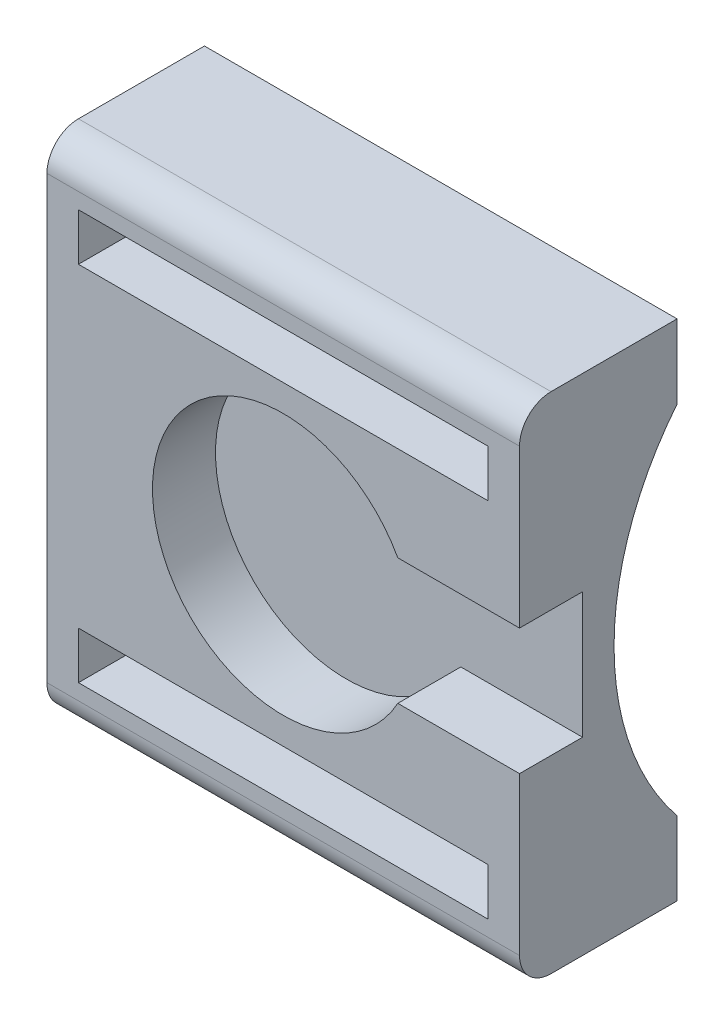
ISO-10303-21;
HEADER;
FILE_DESCRIPTION(('STEP AP214'),'2;1');
FILE_NAME('part.step','',(''),(''),'','','');
FILE_SCHEMA(('AUTOMOTIVE_DESIGN { 1 0 10303 214 1 1 1 1 }'));
ENDSEC;
DATA;
#1=APPLICATION_CONTEXT('core data for automotive mechanical design processes');
#2=APPLICATION_PROTOCOL_DEFINITION('international standard','automotive_design',2000,#1);
#3=PRODUCT_CONTEXT('',#1,'mechanical');
#4=PRODUCT('Part','Part','',(#3));
#5=PRODUCT_RELATED_PRODUCT_CATEGORY('part','',(#4));
#6=PRODUCT_DEFINITION_FORMATION('','',#4);
#7=PRODUCT_DEFINITION_CONTEXT('part definition',#1,'design');
#8=PRODUCT_DEFINITION('design','',#6,#7);
#9=PRODUCT_DEFINITION_SHAPE('','',#8);
#10=(LENGTH_UNIT() NAMED_UNIT(*) SI_UNIT(.MILLI.,.METRE.));
#11=(NAMED_UNIT(*) PLANE_ANGLE_UNIT() SI_UNIT($,.RADIAN.));
#12=(NAMED_UNIT(*) SI_UNIT($,.STERADIAN.) SOLID_ANGLE_UNIT());
#13=UNCERTAINTY_MEASURE_WITH_UNIT(LENGTH_MEASURE(1.E-05),#10,'distance_accuracy_value','');
#14=(GEOMETRIC_REPRESENTATION_CONTEXT(3) GLOBAL_UNCERTAINTY_ASSIGNED_CONTEXT((#13)) GLOBAL_UNIT_ASSIGNED_CONTEXT((#10,
#11,#12)) REPRESENTATION_CONTEXT('',''));
#15=CARTESIAN_POINT('',(0.,0.,0.));
#16=DIRECTION('',(0.,0.,1.));
#17=DIRECTION('',(1.,0.,0.));
#18=AXIS2_PLACEMENT_3D('',#15,#16,#17);
#19=CARTESIAN_POINT('',(0.,0.,0.));
#20=DIRECTION('',(0.,0.,1.));
#21=DIRECTION('',(1.,0.,0.));
#22=AXIS2_PLACEMENT_3D('',#19,#20,#21);
#23=PLANE('',#22);
#24=DIRECTION('',(0.,1.,0.));
#25=VECTOR('',#24,1.);
#26=CARTESIAN_POINT('',(7.5,8.,0.));
#27=LINE('',#26,#25);
#28=CARTESIAN_POINT('',(7.5,5.65685424949238,0.));
#29=VERTEX_POINT('',#28);
#30=CARTESIAN_POINT('',(7.5,8.,0.));
#31=VERTEX_POINT('',#30);
#32=EDGE_CURVE('E309',#29,#31,#27,.T.);
#33=ORIENTED_EDGE('',*,*,#32,.F.);
#34=DIRECTION('',(-1.,0.,0.));
#35=VECTOR('',#34,1.);
#36=CARTESIAN_POINT('',(42.5,5.65685424949238,0.));
#37=LINE('',#36,#35);
#38=CARTESIAN_POINT('',(6.5,5.65685424949238,0.));
#39=VERTEX_POINT('',#38);
#40=EDGE_CURVE('E427',#29,#39,#37,.T.);
#41=ORIENTED_EDGE('',*,*,#40,.T.);
#42=DIRECTION('',(0.,1.,0.));
#43=VECTOR('',#42,1.);
#44=CARTESIAN_POINT('',(6.5,0.,0.));
#45=LINE('',#44,#43);
#46=CARTESIAN_POINT('',(6.5,6.5,0.));
#47=VERTEX_POINT('',#46);
#48=EDGE_CURVE('E258',#39,#47,#45,.T.);
#49=ORIENTED_EDGE('',*,*,#48,.T.);
#50=DIRECTION('',(-1.,0.,0.));
#51=VECTOR('',#50,1.);
#52=CARTESIAN_POINT('',(0.,6.5,0.));
#53=LINE('',#52,#51);
#54=CARTESIAN_POINT('',(-6.5,6.5,0.));
#55=VERTEX_POINT('',#54);
#56=EDGE_CURVE('E261',#47,#55,#53,.T.);
#57=ORIENTED_EDGE('',*,*,#56,.T.);
#58=DIRECTION('',(0.,-1.,0.));
#59=VECTOR('',#58,1.);
#60=CARTESIAN_POINT('',(-6.5,0.,0.));
#61=LINE('',#60,#59);
#62=CARTESIAN_POINT('',(-6.5,5.65685424949238,0.));
#63=VERTEX_POINT('',#62);
#64=EDGE_CURVE('E265',#55,#63,#61,.T.);
#65=ORIENTED_EDGE('',*,*,#64,.T.);
#66=CARTESIAN_POINT('',(-7.5,5.65685424949238,0.));
#67=VERTEX_POINT('',#66);
#68=EDGE_CURVE('E428',#63,#67,#37,.T.);
#69=ORIENTED_EDGE('',*,*,#68,.T.);
#70=DIRECTION('',(0.,-1.,0.));
#71=VECTOR('',#70,1.);
#72=CARTESIAN_POINT('',(-7.5,8.,0.));
#73=LINE('',#72,#71);
#74=CARTESIAN_POINT('',(-7.5,8.,0.));
#75=VERTEX_POINT('',#74);
#76=EDGE_CURVE('E213',#75,#67,#73,.T.);
#77=ORIENTED_EDGE('',*,*,#76,.F.);
#78=DIRECTION('',(-1.,0.,0.));
#79=VECTOR('',#78,1.);
#80=CARTESIAN_POINT('',(-7.5,8.,0.));
#81=LINE('',#80,#79);
#82=EDGE_CURVE('E222',#31,#75,#81,.T.);
#83=ORIENTED_EDGE('',*,*,#82,.F.);
#84=EDGE_LOOP('',(#33,#41,#49,#57,#65,#69,#77,#83));
#85=FACE_BOUND('',#84,.T.);
#86=ADVANCED_FACE('F45',(#85),#23,.F.);
#87=CARTESIAN_POINT('',(7.5,8.,5.));
#88=DIRECTION('',(-1.,0.,0.));
#89=DIRECTION('',(0.,-1.,0.));
#90=AXIS2_PLACEMENT_3D('',#87,#88,#89);
#91=PLANE('',#90);
#92=DIRECTION('',(0.,1.,0.));
#93=VECTOR('',#92,1.);
#94=CARTESIAN_POINT('',(7.5,8.,5.));
#95=LINE('',#94,#93);
#96=CARTESIAN_POINT('',(7.5,-7.,5.));
#97=VERTEX_POINT('',#96);
#98=CARTESIAN_POINT('',(7.5,-2.,5.));
#99=VERTEX_POINT('',#98);
#100=EDGE_CURVE('E295',#97,#99,#95,.T.);
#101=ORIENTED_EDGE('',*,*,#100,.F.);
#102=CARTESIAN_POINT('',(7.5,-7.,4.));
#103=DIRECTION('',(-1.,0.,0.));
#104=DIRECTION('',(0.,-1.,0.));
#105=AXIS2_PLACEMENT_3D('',#102,#103,#104);
#106=CIRCLE('',#105,1.);
#107=CARTESIAN_POINT('',(7.5,-8.,4.));
#108=VERTEX_POINT('',#107);
#109=EDGE_CURVE('E68',#97,#108,#106,.F.);
#110=ORIENTED_EDGE('',*,*,#109,.T.);
#111=DIRECTION('',(0.,0.,-1.));
#112=VECTOR('',#111,1.);
#113=CARTESIAN_POINT('',(7.5,-8.,5.));
#114=LINE('',#113,#112);
#115=CARTESIAN_POINT('',(7.5,-8.,0.));
#116=VERTEX_POINT('',#115);
#117=EDGE_CURVE('E234',#108,#116,#114,.T.);
#118=ORIENTED_EDGE('',*,*,#117,.T.);
#119=CARTESIAN_POINT('',(7.5,-5.65685424949238,0.));
#120=VERTEX_POINT('',#119);
#121=EDGE_CURVE('E227',#116,#120,#27,.T.);
#122=ORIENTED_EDGE('',*,*,#121,.T.);
#123=CARTESIAN_POINT('',(7.5,0.,-7.));
#124=DIRECTION('',(-1.,0.,0.));
#125=DIRECTION('',(0.,-1.,0.));
#126=AXIS2_PLACEMENT_3D('',#123,#124,#125);
#127=CIRCLE('',#126,9.);
#128=EDGE_CURVE('E424',#120,#29,#127,.T.);
#129=ORIENTED_EDGE('',*,*,#128,.T.);
#130=ORIENTED_EDGE('',*,*,#32,.T.);
#131=DIRECTION('',(0.,0.,-1.));
#132=VECTOR('',#131,1.);
#133=CARTESIAN_POINT('',(7.5,8.,5.));
#134=LINE('',#133,#132);
#135=CARTESIAN_POINT('',(7.5,8.,4.));
#136=VERTEX_POINT('',#135);
#137=EDGE_CURVE('E244',#136,#31,#134,.T.);
#138=ORIENTED_EDGE('',*,*,#137,.F.);
#139=CARTESIAN_POINT('',(7.5,7.,4.));
#140=DIRECTION('',(-1.,0.,0.));
#141=DIRECTION('',(0.,-1.,0.));
#142=AXIS2_PLACEMENT_3D('',#139,#140,#141);
#143=CIRCLE('',#142,1.);
#144=CARTESIAN_POINT('',(7.5,7.,5.));
#145=VERTEX_POINT('',#144);
#146=EDGE_CURVE('E283',#136,#145,#143,.F.);
#147=ORIENTED_EDGE('',*,*,#146,.T.);
#148=CARTESIAN_POINT('',(7.5,2.,5.));
#149=VERTEX_POINT('',#148);
#150=EDGE_CURVE('E233',#149,#145,#95,.T.);
#151=ORIENTED_EDGE('',*,*,#150,.F.);
#152=DIRECTION('',(0.,0.,1.));
#153=VECTOR('',#152,1.);
#154=CARTESIAN_POINT('',(7.5,2.,7.));
#155=LINE('',#154,#153);
#156=CARTESIAN_POINT('',(7.5,2.,3.));
#157=VERTEX_POINT('',#156);
#158=EDGE_CURVE('E350',#157,#149,#155,.T.);
#159=ORIENTED_EDGE('',*,*,#158,.F.);
#160=DIRECTION('',(0.,1.,0.));
#161=VECTOR('',#160,1.);
#162=CARTESIAN_POINT('',(7.5,2.,3.));
#163=LINE('',#162,#161);
#164=CARTESIAN_POINT('',(7.5,-2.,3.));
#165=VERTEX_POINT('',#164);
#166=EDGE_CURVE('E353',#165,#157,#163,.T.);
#167=ORIENTED_EDGE('',*,*,#166,.F.);
#168=DIRECTION('',(0.,0.,-1.));
#169=VECTOR('',#168,1.);
#170=CARTESIAN_POINT('',(7.5,-2.,7.));
#171=LINE('',#170,#169);
#172=EDGE_CURVE('E344',#99,#165,#171,.T.);
#173=ORIENTED_EDGE('',*,*,#172,.F.);
#174=EDGE_LOOP('',(#101,#110,#118,#122,#129,#130,#138,#147,#151,#159,#167,#173));
#175=FACE_BOUND('',#174,.T.);
#176=ADVANCED_FACE('F459',(#175),#91,.F.);
#177=CARTESIAN_POINT('',(-7.5,8.,5.));
#178=DIRECTION('',(0.,-1.,0.));
#179=DIRECTION('',(0.,0.,-1.));
#180=AXIS2_PLACEMENT_3D('',#177,#178,#179);
#181=PLANE('',#180);
#182=DIRECTION('',(0.,0.,-1.));
#183=VECTOR('',#182,1.);
#184=CARTESIAN_POINT('',(-7.5,8.,5.));
#185=LINE('',#184,#183);
#186=CARTESIAN_POINT('',(-7.5,8.,4.));
#187=VERTEX_POINT('',#186);
#188=EDGE_CURVE('E241',#187,#75,#185,.T.);
#189=ORIENTED_EDGE('',*,*,#188,.F.);
#190=DIRECTION('',(-1.,0.,0.));
#191=VECTOR('',#190,1.);
#192=CARTESIAN_POINT('',(7.5,8.,4.));
#193=LINE('',#192,#191);
#194=EDGE_CURVE('E280',#187,#136,#193,.F.);
#195=ORIENTED_EDGE('',*,*,#194,.T.);
#196=ORIENTED_EDGE('',*,*,#137,.T.);
#197=ORIENTED_EDGE('',*,*,#82,.T.);
#198=EDGE_LOOP('',(#189,#195,#196,#197));
#199=FACE_BOUND('',#198,.T.);
#200=ADVANCED_FACE('F462',(#199),#181,.F.);
#201=CARTESIAN_POINT('',(-7.5,8.,5.));
#202=DIRECTION('',(1.,0.,0.));
#203=DIRECTION('',(0.,1.,0.));
#204=AXIS2_PLACEMENT_3D('',#201,#202,#203);
#205=PLANE('',#204);
#206=DIRECTION('',(0.,0.,-1.));
#207=VECTOR('',#206,1.);
#208=CARTESIAN_POINT('',(-7.5,-8.,5.));
#209=LINE('',#208,#207);
#210=CARTESIAN_POINT('',(-7.5,-8.,4.));
#211=VERTEX_POINT('',#210);
#212=CARTESIAN_POINT('',(-7.5,-8.,0.));
#213=VERTEX_POINT('',#212);
#214=EDGE_CURVE('E237',#211,#213,#209,.T.);
#215=ORIENTED_EDGE('',*,*,#214,.F.);
#216=CARTESIAN_POINT('',(-7.5,-7.,4.));
#217=DIRECTION('',(1.,0.,0.));
#218=DIRECTION('',(0.,1.,0.));
#219=AXIS2_PLACEMENT_3D('',#216,#217,#218);
#220=CIRCLE('',#219,1.);
#221=CARTESIAN_POINT('',(-7.5,-7.,5.));
#222=VERTEX_POINT('',#221);
#223=EDGE_CURVE('E11',#211,#222,#220,.F.);
#224=ORIENTED_EDGE('',*,*,#223,.T.);
#225=DIRECTION('',(0.,-1.,0.));
#226=VECTOR('',#225,1.);
#227=CARTESIAN_POINT('',(-7.5,8.,5.));
#228=LINE('',#227,#226);
#229=CARTESIAN_POINT('',(-7.5,7.,5.));
#230=VERTEX_POINT('',#229);
#231=EDGE_CURVE('E238',#230,#222,#228,.T.);
#232=ORIENTED_EDGE('',*,*,#231,.F.);
#233=CARTESIAN_POINT('',(-7.5,7.,4.));
#234=DIRECTION('',(1.,0.,0.));
#235=DIRECTION('',(0.,1.,0.));
#236=AXIS2_PLACEMENT_3D('',#233,#234,#235);
#237=CIRCLE('',#236,1.);
#238=EDGE_CURVE('E277',#230,#187,#237,.F.);
#239=ORIENTED_EDGE('',*,*,#238,.T.);
#240=ORIENTED_EDGE('',*,*,#188,.T.);
#241=ORIENTED_EDGE('',*,*,#76,.T.);
#242=CARTESIAN_POINT('',(-7.5,0.,-7.));
#243=DIRECTION('',(-1.,0.,0.));
#244=DIRECTION('',(0.,-1.,0.));
#245=AXIS2_PLACEMENT_3D('',#242,#243,#244);
#246=CIRCLE('',#245,9.);
#247=CARTESIAN_POINT('',(-7.5,-5.65685424949238,0.));
#248=VERTEX_POINT('',#247);
#249=EDGE_CURVE('E195',#248,#67,#246,.T.);
#250=ORIENTED_EDGE('',*,*,#249,.F.);
#251=EDGE_CURVE('E210',#248,#213,#73,.T.);
#252=ORIENTED_EDGE('',*,*,#251,.T.);
#253=EDGE_LOOP('',(#215,#224,#232,#239,#240,#241,#250,#252));
#254=FACE_BOUND('',#253,.T.);
#255=ADVANCED_FACE('F209',(#254),#205,.F.);
#256=CARTESIAN_POINT('',(-7.5,-8.,5.));
#257=DIRECTION('',(0.,1.,0.));
#258=DIRECTION('',(0.,0.,1.));
#259=AXIS2_PLACEMENT_3D('',#256,#257,#258);
#260=PLANE('',#259);
#261=ORIENTED_EDGE('',*,*,#117,.F.);
#262=DIRECTION('',(1.,0.,0.));
#263=VECTOR('',#262,1.);
#264=CARTESIAN_POINT('',(-7.5,-8.,4.));
#265=LINE('',#264,#263);
#266=EDGE_CURVE('E54',#108,#211,#265,.F.);
#267=ORIENTED_EDGE('',*,*,#266,.T.);
#268=ORIENTED_EDGE('',*,*,#214,.T.);
#269=DIRECTION('',(1.,0.,0.));
#270=VECTOR('',#269,1.);
#271=CARTESIAN_POINT('',(-7.5,-8.,0.));
#272=LINE('',#271,#270);
#273=EDGE_CURVE('E220',#213,#116,#272,.T.);
#274=ORIENTED_EDGE('',*,*,#273,.T.);
#275=EDGE_LOOP('',(#261,#267,#268,#274));
#276=FACE_BOUND('',#275,.T.);
#277=ADVANCED_FACE('F489',(#276),#260,.F.);
#278=CARTESIAN_POINT('',(0.,0.,5.));
#279=DIRECTION('',(0.,0.,1.));
#280=DIRECTION('',(1.,0.,0.));
#281=AXIS2_PLACEMENT_3D('',#278,#279,#280);
#282=PLANE('',#281);
#283=DIRECTION('',(0.,-1.,0.));
#284=VECTOR('',#283,1.);
#285=CARTESIAN_POINT('',(-6.5,6.5,5.));
#286=LINE('',#285,#284);
#287=CARTESIAN_POINT('',(-6.5,6.5,5.));
#288=VERTEX_POINT('',#287);
#289=CARTESIAN_POINT('',(-6.5,5.,5.));
#290=VERTEX_POINT('',#289);
#291=EDGE_CURVE('E361',#288,#290,#286,.T.);
#292=ORIENTED_EDGE('',*,*,#291,.F.);
#293=DIRECTION('',(-1.,0.,0.));
#294=VECTOR('',#293,1.);
#295=CARTESIAN_POINT('',(-6.5,6.5,5.));
#296=LINE('',#295,#294);
#297=CARTESIAN_POINT('',(6.5,6.5,5.));
#298=VERTEX_POINT('',#297);
#299=EDGE_CURVE('E390',#298,#288,#296,.T.);
#300=ORIENTED_EDGE('',*,*,#299,.F.);
#301=DIRECTION('',(0.,1.,0.));
#302=VECTOR('',#301,1.);
#303=CARTESIAN_POINT('',(6.5,6.5,5.));
#304=LINE('',#303,#302);
#305=CARTESIAN_POINT('',(6.5,5.,5.));
#306=VERTEX_POINT('',#305);
#307=EDGE_CURVE('E401',#306,#298,#304,.T.);
#308=ORIENTED_EDGE('',*,*,#307,.F.);
#309=DIRECTION('',(1.,0.,0.));
#310=VECTOR('',#309,1.);
#311=CARTESIAN_POINT('',(-6.5,5.,5.));
#312=LINE('',#311,#310);
#313=EDGE_CURVE('E405',#290,#306,#312,.T.);
#314=ORIENTED_EDGE('',*,*,#313,.F.);
#315=EDGE_LOOP('',(#292,#300,#308,#314));
#316=FACE_BOUND('',#315,.T.);
#317=DIRECTION('',(0.,-1.,0.));
#318=VECTOR('',#317,1.);
#319=CARTESIAN_POINT('',(-6.5,-5.,5.));
#320=LINE('',#319,#318);
#321=CARTESIAN_POINT('',(-6.5,-5.,5.));
#322=VERTEX_POINT('',#321);
#323=CARTESIAN_POINT('',(-6.5,-6.5,5.));
#324=VERTEX_POINT('',#323);
#325=EDGE_CURVE('E358',#322,#324,#320,.T.);
#326=ORIENTED_EDGE('',*,*,#325,.F.);
#327=DIRECTION('',(-1.,0.,0.));
#328=VECTOR('',#327,1.);
#329=CARTESIAN_POINT('',(-6.5,-5.,5.));
#330=LINE('',#329,#328);
#331=CARTESIAN_POINT('',(6.5,-5.,5.));
#332=VERTEX_POINT('',#331);
#333=EDGE_CURVE('E370',#332,#322,#330,.T.);
#334=ORIENTED_EDGE('',*,*,#333,.F.);
#335=DIRECTION('',(0.,1.,0.));
#336=VECTOR('',#335,1.);
#337=CARTESIAN_POINT('',(6.5,-5.,5.));
#338=LINE('',#337,#336);
#339=CARTESIAN_POINT('',(6.5,-6.5,5.));
#340=VERTEX_POINT('',#339);
#341=EDGE_CURVE('E366',#340,#332,#338,.T.);
#342=ORIENTED_EDGE('',*,*,#341,.F.);
#343=DIRECTION('',(1.,0.,0.));
#344=VECTOR('',#343,1.);
#345=CARTESIAN_POINT('',(-6.5,-6.5,5.));
#346=LINE('',#345,#344);
#347=EDGE_CURVE('E362',#324,#340,#346,.T.);
#348=ORIENTED_EDGE('',*,*,#347,.F.);
#349=EDGE_LOOP('',(#326,#334,#342,#348));
#350=FACE_BOUND('',#349,.T.);
#351=ORIENTED_EDGE('',*,*,#231,.T.);
#352=DIRECTION('',(1.,0.,0.));
#353=VECTOR('',#352,1.);
#354=CARTESIAN_POINT('',(7.5,-7.,5.));
#355=LINE('',#354,#353);
#356=EDGE_CURVE('E286',#222,#97,#355,.T.);
#357=ORIENTED_EDGE('',*,*,#356,.T.);
#358=ORIENTED_EDGE('',*,*,#100,.T.);
#359=DIRECTION('',(1.,0.,0.));
#360=VECTOR('',#359,1.);
#361=CARTESIAN_POINT('',(0.,-2.,5.));
#362=LINE('',#361,#360);
#363=CARTESIAN_POINT('',(3.63627556711534,-2.,5.));
#364=VERTEX_POINT('',#363);
#365=EDGE_CURVE('E324',#364,#99,#362,.T.);
#366=ORIENTED_EDGE('',*,*,#365,.F.);
#367=CARTESIAN_POINT('',(0.,0.,5.));
#368=DIRECTION('',(0.,0.,1.));
#369=DIRECTION('',(1.,0.,0.));
#370=AXIS2_PLACEMENT_3D('',#367,#368,#369);
#371=CIRCLE('',#370,4.15);
#372=CARTESIAN_POINT('',(3.63627556711534,2.,5.));
#373=VERTEX_POINT('',#372);
#374=EDGE_CURVE('E305',#373,#364,#371,.T.);
#375=ORIENTED_EDGE('',*,*,#374,.F.);
#376=DIRECTION('',(-1.,0.,0.));
#377=VECTOR('',#376,1.);
#378=CARTESIAN_POINT('',(0.,2.,5.));
#379=LINE('',#378,#377);
#380=EDGE_CURVE('E333',#149,#373,#379,.T.);
#381=ORIENTED_EDGE('',*,*,#380,.F.);
#382=ORIENTED_EDGE('',*,*,#150,.T.);
#383=DIRECTION('',(-1.,0.,0.));
#384=VECTOR('',#383,1.);
#385=CARTESIAN_POINT('',(-7.5,7.,5.));
#386=LINE('',#385,#384);
#387=EDGE_CURVE('E273',#145,#230,#386,.T.);
#388=ORIENTED_EDGE('',*,*,#387,.T.);
#389=EDGE_LOOP('',(#351,#357,#358,#366,#375,#381,#382,#388));
#390=FACE_BOUND('',#389,.T.);
#391=ADVANCED_FACE('F451',(#316,#350,#390),#282,.T.);
#392=ORIENTED_EDGE('',*,*,#251,.F.);
#393=DIRECTION('',(-1.,0.,0.));
#394=VECTOR('',#393,1.);
#395=CARTESIAN_POINT('',(42.5,-5.65685424949237,0.));
#396=LINE('',#395,#394);
#397=CARTESIAN_POINT('',(-6.5,-5.65685424949238,0.));
#398=VERTEX_POINT('',#397);
#399=EDGE_CURVE('E192',#248,#398,#396,.F.);
#400=ORIENTED_EDGE('',*,*,#399,.T.);
#401=DIRECTION('',(0.,-1.,0.));
#402=VECTOR('',#401,1.);
#403=CARTESIAN_POINT('',(-6.5,0.,0.));
#404=LINE('',#403,#402);
#405=CARTESIAN_POINT('',(-6.5,-6.5,0.));
#406=VERTEX_POINT('',#405);
#407=EDGE_CURVE('E255',#398,#406,#404,.T.);
#408=ORIENTED_EDGE('',*,*,#407,.T.);
#409=DIRECTION('',(1.,0.,0.));
#410=VECTOR('',#409,1.);
#411=CARTESIAN_POINT('',(0.,-6.5,0.));
#412=LINE('',#411,#410);
#413=CARTESIAN_POINT('',(6.5,-6.5,0.));
#414=VERTEX_POINT('',#413);
#415=EDGE_CURVE('E247',#406,#414,#412,.T.);
#416=ORIENTED_EDGE('',*,*,#415,.T.);
#417=DIRECTION('',(0.,1.,0.));
#418=VECTOR('',#417,1.);
#419=CARTESIAN_POINT('',(6.5,0.,0.));
#420=LINE('',#419,#418);
#421=CARTESIAN_POINT('',(6.5,-5.65685424949238,0.));
#422=VERTEX_POINT('',#421);
#423=EDGE_CURVE('E251',#414,#422,#420,.T.);
#424=ORIENTED_EDGE('',*,*,#423,.T.);
#425=EDGE_CURVE('E205',#422,#120,#396,.F.);
#426=ORIENTED_EDGE('',*,*,#425,.T.);
#427=ORIENTED_EDGE('',*,*,#121,.F.);
#428=ORIENTED_EDGE('',*,*,#273,.F.);
#429=EDGE_LOOP('',(#392,#400,#408,#416,#424,#426,#427,#428));
#430=FACE_BOUND('',#429,.T.);
#431=ADVANCED_FACE('F217',(#430),#23,.F.);
#432=CARTESIAN_POINT('',(0.,0.,3.));
#433=DIRECTION('',(0.,0.,1.));
#434=DIRECTION('',(1.,0.,0.));
#435=AXIS2_PLACEMENT_3D('',#432,#433,#434);
#436=CYLINDRICAL_SURFACE('',#435,4.15);
#437=ORIENTED_EDGE('',*,*,#374,.T.);
#438=DIRECTION('',(0.,0.,1.));
#439=VECTOR('',#438,1.);
#440=CARTESIAN_POINT('',(3.63627556711534,-2.,3.));
#441=LINE('',#440,#439);
#442=CARTESIAN_POINT('',(3.63627556711534,-2.,3.));
#443=VERTEX_POINT('',#442);
#444=EDGE_CURVE('E329',#364,#443,#441,.F.);
#445=ORIENTED_EDGE('',*,*,#444,.T.);
#446=CARTESIAN_POINT('',(0.,0.,3.));
#447=DIRECTION('',(0.,0.,1.));
#448=DIRECTION('',(1.,0.,0.));
#449=AXIS2_PLACEMENT_3D('',#446,#447,#448);
#450=CIRCLE('',#449,4.15);
#451=CARTESIAN_POINT('',(3.63627556711534,2.,3.));
#452=VERTEX_POINT('',#451);
#453=EDGE_CURVE('E313',#452,#443,#450,.T.);
#454=ORIENTED_EDGE('',*,*,#453,.F.);
#455=DIRECTION('',(0.,0.,1.));
#456=VECTOR('',#455,1.);
#457=CARTESIAN_POINT('',(3.63627556711534,2.,3.));
#458=LINE('',#457,#456);
#459=EDGE_CURVE('E336',#452,#373,#458,.T.);
#460=ORIENTED_EDGE('',*,*,#459,.T.);
#461=EDGE_LOOP('',(#437,#445,#454,#460));
#462=FACE_BOUND('',#461,.T.);
#463=ADVANCED_FACE('F513',(#462),#436,.F.);
#464=CARTESIAN_POINT('',(0.,0.,3.));
#465=DIRECTION('',(0.,0.,1.));
#466=DIRECTION('',(1.,0.,0.));
#467=AXIS2_PLACEMENT_3D('',#464,#465,#466);
#468=PLANE('',#467);
#469=ORIENTED_EDGE('',*,*,#453,.T.);
#470=DIRECTION('',(1.,0.,0.));
#471=VECTOR('',#470,1.);
#472=CARTESIAN_POINT('',(3.5,-2.,3.));
#473=LINE('',#472,#471);
#474=EDGE_CURVE('E340',#443,#165,#473,.T.);
#475=ORIENTED_EDGE('',*,*,#474,.T.);
#476=ORIENTED_EDGE('',*,*,#166,.T.);
#477=DIRECTION('',(1.,0.,0.));
#478=VECTOR('',#477,1.);
#479=CARTESIAN_POINT('',(3.5,2.,3.));
#480=LINE('',#479,#478);
#481=EDGE_CURVE('E341',#452,#157,#480,.T.);
#482=ORIENTED_EDGE('',*,*,#481,.F.);
#483=EDGE_LOOP('',(#469,#475,#476,#482));
#484=FACE_BOUND('',#483,.T.);
#485=ADVANCED_FACE('F546',(#484),#468,.T.);
#486=CARTESIAN_POINT('',(3.5,-2.,7.));
#487=DIRECTION('',(0.,-1.,0.));
#488=DIRECTION('',(1.,0.,0.));
#489=AXIS2_PLACEMENT_3D('',#486,#487,#488);
#490=PLANE('',#489);
#491=ORIENTED_EDGE('',*,*,#365,.T.);
#492=ORIENTED_EDGE('',*,*,#172,.T.);
#493=ORIENTED_EDGE('',*,*,#474,.F.);
#494=ORIENTED_EDGE('',*,*,#444,.F.);
#495=EDGE_LOOP('',(#491,#492,#493,#494));
#496=FACE_BOUND('',#495,.T.);
#497=ADVANCED_FACE('F555',(#496),#490,.F.);
#498=CARTESIAN_POINT('',(3.5,2.,7.));
#499=DIRECTION('',(0.,1.,0.));
#500=DIRECTION('',(-1.,0.,0.));
#501=AXIS2_PLACEMENT_3D('',#498,#499,#500);
#502=PLANE('',#501);
#503=ORIENTED_EDGE('',*,*,#380,.T.);
#504=ORIENTED_EDGE('',*,*,#459,.F.);
#505=ORIENTED_EDGE('',*,*,#481,.T.);
#506=ORIENTED_EDGE('',*,*,#158,.T.);
#507=EDGE_LOOP('',(#503,#504,#505,#506));
#508=FACE_BOUND('',#507,.T.);
#509=ADVANCED_FACE('F566',(#508),#502,.F.);
#510=CARTESIAN_POINT('',(-6.5,-5.,-5.));
#511=DIRECTION('',(-1.,0.,0.));
#512=DIRECTION('',(0.,0.,1.));
#513=AXIS2_PLACEMENT_3D('',#510,#511,#512);
#514=PLANE('',#513);
#515=ORIENTED_EDGE('',*,*,#407,.F.);
#516=CARTESIAN_POINT('',(-6.5,0.,-7.));
#517=DIRECTION('',(-1.,0.,0.));
#518=DIRECTION('',(0.,0.,1.));
#519=AXIS2_PLACEMENT_3D('',#516,#517,#518);
#520=CIRCLE('',#519,9.);
#521=CARTESIAN_POINT('',(-6.5,-5.00000000000001,0.483314773547879));
#522=VERTEX_POINT('',#521);
#523=EDGE_CURVE('E198',#398,#522,#520,.T.);
#524=ORIENTED_EDGE('',*,*,#523,.T.);
#525=DIRECTION('',(0.,0.,1.));
#526=VECTOR('',#525,1.);
#527=CARTESIAN_POINT('',(-6.5,-5.,-5.));
#528=LINE('',#527,#526);
#529=EDGE_CURVE('E203',#522,#322,#528,.T.);
#530=ORIENTED_EDGE('',*,*,#529,.T.);
#531=ORIENTED_EDGE('',*,*,#325,.T.);
#532=DIRECTION('',(0.,0.,1.));
#533=VECTOR('',#532,1.);
#534=CARTESIAN_POINT('',(-6.5,-6.5,-5.));
#535=LINE('',#534,#533);
#536=EDGE_CURVE('E374',#406,#324,#535,.T.);
#537=ORIENTED_EDGE('',*,*,#536,.F.);
#538=EDGE_LOOP('',(#515,#524,#530,#531,#537));
#539=FACE_BOUND('',#538,.T.);
#540=ADVANCED_FACE('F501',(#539),#514,.F.);
#541=CARTESIAN_POINT('',(-6.5,-5.,-5.));
#542=DIRECTION('',(0.,1.,0.));
#543=DIRECTION('',(0.,0.,1.));
#544=AXIS2_PLACEMENT_3D('',#541,#542,#543);
#545=PLANE('',#544);
#546=ORIENTED_EDGE('',*,*,#529,.F.);
#547=DIRECTION('',(-1.,0.,0.));
#548=VECTOR('',#547,1.);
#549=CARTESIAN_POINT('',(42.5,-5.,0.483314773547879));
#550=LINE('',#549,#548);
#551=CARTESIAN_POINT('',(6.5,-5.,0.483314773547881));
#552=VERTEX_POINT('',#551);
#553=EDGE_CURVE('E414',#522,#552,#550,.F.);
#554=ORIENTED_EDGE('',*,*,#553,.T.);
#555=DIRECTION('',(0.,0.,1.));
#556=VECTOR('',#555,1.);
#557=CARTESIAN_POINT('',(6.5,-5.,-5.));
#558=LINE('',#557,#556);
#559=EDGE_CURVE('E377',#552,#332,#558,.T.);
#560=ORIENTED_EDGE('',*,*,#559,.T.);
#561=ORIENTED_EDGE('',*,*,#333,.T.);
#562=EDGE_LOOP('',(#546,#554,#560,#561));
#563=FACE_BOUND('',#562,.T.);
#564=ADVANCED_FACE('F498',(#563),#545,.F.);
#565=CARTESIAN_POINT('',(6.5,-5.,-5.));
#566=DIRECTION('',(1.,0.,0.));
#567=DIRECTION('',(0.,0.,-1.));
#568=AXIS2_PLACEMENT_3D('',#565,#566,#567);
#569=PLANE('',#568);
#570=ORIENTED_EDGE('',*,*,#559,.F.);
#571=CARTESIAN_POINT('',(6.5,0.,-7.));
#572=DIRECTION('',(1.,0.,0.));
#573=DIRECTION('',(0.,0.,-1.));
#574=AXIS2_PLACEMENT_3D('',#571,#572,#573);
#575=CIRCLE('',#574,9.);
#576=EDGE_CURVE('E418',#552,#422,#575,.T.);
#577=ORIENTED_EDGE('',*,*,#576,.T.);
#578=ORIENTED_EDGE('',*,*,#423,.F.);
#579=DIRECTION('',(0.,0.,1.));
#580=VECTOR('',#579,1.);
#581=CARTESIAN_POINT('',(6.5,-6.5,-5.));
#582=LINE('',#581,#580);
#583=EDGE_CURVE('E380',#414,#340,#582,.T.);
#584=ORIENTED_EDGE('',*,*,#583,.T.);
#585=ORIENTED_EDGE('',*,*,#341,.T.);
#586=EDGE_LOOP('',(#570,#577,#578,#584,#585));
#587=FACE_BOUND('',#586,.T.);
#588=ADVANCED_FACE('F493',(#587),#569,.F.);
#589=CARTESIAN_POINT('',(-6.5,-6.5,-5.));
#590=DIRECTION('',(0.,-1.,0.));
#591=DIRECTION('',(0.,0.,-1.));
#592=AXIS2_PLACEMENT_3D('',#589,#590,#591);
#593=PLANE('',#592);
#594=ORIENTED_EDGE('',*,*,#536,.T.);
#595=ORIENTED_EDGE('',*,*,#347,.T.);
#596=ORIENTED_EDGE('',*,*,#583,.F.);
#597=ORIENTED_EDGE('',*,*,#415,.F.);
#598=EDGE_LOOP('',(#594,#595,#596,#597));
#599=FACE_BOUND('',#598,.T.);
#600=ADVANCED_FACE('F505',(#599),#593,.F.);
#601=CARTESIAN_POINT('',(-6.5,6.5,-5.));
#602=DIRECTION('',(-1.,0.,0.));
#603=DIRECTION('',(0.,0.,1.));
#604=AXIS2_PLACEMENT_3D('',#601,#602,#603);
#605=PLANE('',#604);
#606=DIRECTION('',(0.,0.,1.));
#607=VECTOR('',#606,1.);
#608=CARTESIAN_POINT('',(-6.5,5.,-5.));
#609=LINE('',#608,#607);
#610=CARTESIAN_POINT('',(-6.5,5.,0.483314773547885));
#611=VERTEX_POINT('',#610);
#612=EDGE_CURVE('E386',#611,#290,#609,.T.);
#613=ORIENTED_EDGE('',*,*,#612,.F.);
#614=CARTESIAN_POINT('',(-6.5,0.,-7.));
#615=DIRECTION('',(-1.,0.,0.));
#616=DIRECTION('',(0.,0.,1.));
#617=AXIS2_PLACEMENT_3D('',#614,#615,#616);
#618=CIRCLE('',#617,9.);
#619=EDGE_CURVE('E431',#611,#63,#618,.T.);
#620=ORIENTED_EDGE('',*,*,#619,.T.);
#621=ORIENTED_EDGE('',*,*,#64,.F.);
#622=DIRECTION('',(0.,0.,1.));
#623=VECTOR('',#622,1.);
#624=CARTESIAN_POINT('',(-6.5,6.5,-5.));
#625=LINE('',#624,#623);
#626=EDGE_CURVE('E357',#55,#288,#625,.T.);
#627=ORIENTED_EDGE('',*,*,#626,.T.);
#628=ORIENTED_EDGE('',*,*,#291,.T.);
#629=EDGE_LOOP('',(#613,#620,#621,#627,#628));
#630=FACE_BOUND('',#629,.T.);
#631=ADVANCED_FACE('F609',(#630),#605,.F.);
#632=CARTESIAN_POINT('',(-6.5,6.5,-5.));
#633=DIRECTION('',(0.,1.,0.));
#634=DIRECTION('',(0.,0.,1.));
#635=AXIS2_PLACEMENT_3D('',#632,#633,#634);
#636=PLANE('',#635);
#637=DIRECTION('',(0.,0.,1.));
#638=VECTOR('',#637,1.);
#639=CARTESIAN_POINT('',(6.5,6.5,-5.));
#640=LINE('',#639,#638);
#641=EDGE_CURVE('E393',#47,#298,#640,.T.);
#642=ORIENTED_EDGE('',*,*,#641,.T.);
#643=ORIENTED_EDGE('',*,*,#299,.T.);
#644=ORIENTED_EDGE('',*,*,#626,.F.);
#645=ORIENTED_EDGE('',*,*,#56,.F.);
#646=EDGE_LOOP('',(#642,#643,#644,#645));
#647=FACE_BOUND('',#646,.T.);
#648=ADVANCED_FACE('F455',(#647),#636,.F.);
#649=CARTESIAN_POINT('',(6.5,6.5,-5.));
#650=DIRECTION('',(1.,0.,0.));
#651=DIRECTION('',(0.,0.,-1.));
#652=AXIS2_PLACEMENT_3D('',#649,#650,#651);
#653=PLANE('',#652);
#654=ORIENTED_EDGE('',*,*,#48,.F.);
#655=CARTESIAN_POINT('',(6.5,0.,-7.));
#656=DIRECTION('',(1.,0.,0.));
#657=DIRECTION('',(0.,0.,-1.));
#658=AXIS2_PLACEMENT_3D('',#655,#656,#657);
#659=CIRCLE('',#658,9.);
#660=CARTESIAN_POINT('',(6.5,5.,0.483314773547885));
#661=VERTEX_POINT('',#660);
#662=EDGE_CURVE('E215',#39,#661,#659,.T.);
#663=ORIENTED_EDGE('',*,*,#662,.T.);
#664=DIRECTION('',(0.,0.,1.));
#665=VECTOR('',#664,1.);
#666=CARTESIAN_POINT('',(6.5,5.,-5.));
#667=LINE('',#666,#665);
#668=EDGE_CURVE('E389',#661,#306,#667,.T.);
#669=ORIENTED_EDGE('',*,*,#668,.T.);
#670=ORIENTED_EDGE('',*,*,#307,.T.);
#671=ORIENTED_EDGE('',*,*,#641,.F.);
#672=EDGE_LOOP('',(#654,#663,#669,#670,#671));
#673=FACE_BOUND('',#672,.T.);
#674=ADVANCED_FACE('F440',(#673),#653,.F.);
#675=CARTESIAN_POINT('',(-6.5,5.,-5.));
#676=DIRECTION('',(0.,-1.,0.));
#677=DIRECTION('',(0.,0.,-1.));
#678=AXIS2_PLACEMENT_3D('',#675,#676,#677);
#679=PLANE('',#678);
#680=ORIENTED_EDGE('',*,*,#668,.F.);
#681=DIRECTION('',(-1.,0.,0.));
#682=VECTOR('',#681,1.);
#683=CARTESIAN_POINT('',(42.5,5.,0.483314773547885));
#684=LINE('',#683,#682);
#685=EDGE_CURVE('E269',#661,#611,#684,.T.);
#686=ORIENTED_EDGE('',*,*,#685,.T.);
#687=ORIENTED_EDGE('',*,*,#612,.T.);
#688=ORIENTED_EDGE('',*,*,#313,.T.);
#689=EDGE_LOOP('',(#680,#686,#687,#688));
#690=FACE_BOUND('',#689,.T.);
#691=ADVANCED_FACE('F444',(#690),#679,.F.);
#692=CARTESIAN_POINT('',(42.5,0.,-7.));
#693=DIRECTION('',(-1.,0.,0.));
#694=DIRECTION('',(0.,-1.,0.));
#695=AXIS2_PLACEMENT_3D('',#692,#693,#694);
#696=CYLINDRICAL_SURFACE('',#695,9.);
#697=ORIENTED_EDGE('',*,*,#249,.T.);
#698=ORIENTED_EDGE('',*,*,#68,.F.);
#699=ORIENTED_EDGE('',*,*,#619,.F.);
#700=ORIENTED_EDGE('',*,*,#685,.F.);
#701=ORIENTED_EDGE('',*,*,#662,.F.);
#702=ORIENTED_EDGE('',*,*,#40,.F.);
#703=ORIENTED_EDGE('',*,*,#128,.F.);
#704=ORIENTED_EDGE('',*,*,#425,.F.);
#705=ORIENTED_EDGE('',*,*,#576,.F.);
#706=ORIENTED_EDGE('',*,*,#553,.F.);
#707=ORIENTED_EDGE('',*,*,#523,.F.);
#708=ORIENTED_EDGE('',*,*,#399,.F.);
#709=EDGE_LOOP('',(#697,#698,#699,#700,#701,#702,#703,#704,#705,#706,#707,#708));
#710=FACE_BOUND('',#709,.T.);
#711=ADVANCED_FACE('F194',(#710),#696,.F.);
#712=CARTESIAN_POINT('',(0.,7.,4.));
#713=DIRECTION('',(1.,0.,0.));
#714=DIRECTION('',(0.,0.,-1.));
#715=AXIS2_PLACEMENT_3D('',#712,#713,#714);
#716=CYLINDRICAL_SURFACE('',#715,1.);
#717=ORIENTED_EDGE('',*,*,#146,.F.);
#718=ORIENTED_EDGE('',*,*,#194,.F.);
#719=ORIENTED_EDGE('',*,*,#238,.F.);
#720=ORIENTED_EDGE('',*,*,#387,.F.);
#721=EDGE_LOOP('',(#717,#718,#719,#720));
#722=FACE_BOUND('',#721,.T.);
#723=ADVANCED_FACE('F474',(#722),#716,.T.);
#724=CARTESIAN_POINT('',(0.,-7.,4.));
#725=DIRECTION('',(-1.,0.,0.));
#726=DIRECTION('',(0.,0.,1.));
#727=AXIS2_PLACEMENT_3D('',#724,#725,#726);
#728=CYLINDRICAL_SURFACE('',#727,1.);
#729=ORIENTED_EDGE('',*,*,#223,.F.);
#730=ORIENTED_EDGE('',*,*,#266,.F.);
#731=ORIENTED_EDGE('',*,*,#109,.F.);
#732=ORIENTED_EDGE('',*,*,#356,.F.);
#733=EDGE_LOOP('',(#729,#730,#731,#732));
#734=FACE_BOUND('',#733,.T.);
#735=ADVANCED_FACE('F47',(#734),#728,.T.);
#736=CLOSED_SHELL('',(#86,#176,#200,#255,#277,#391,#431,#463,#485,#497,#509,#540,#564,#588,#600,
#631,#648,#674,#691,#711,#723,#735));
#737=MANIFOLD_SOLID_BREP('B2',#736);
#738=ADVANCED_BREP_SHAPE_REPRESENTATION('',(#18,#737),#14);
#739=SHAPE_DEFINITION_REPRESENTATION(#9,#738);
ENDSEC;
END-ISO-10303-21;
